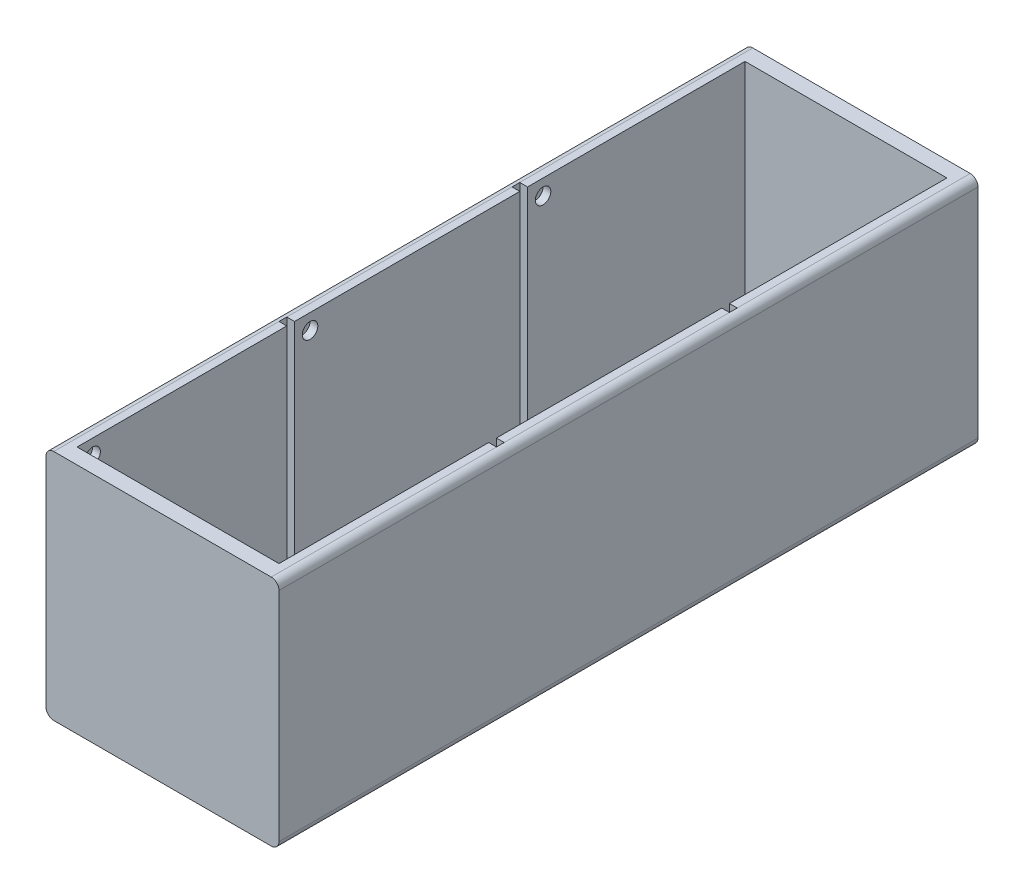
ISO-10303-21;
HEADER;
FILE_DESCRIPTION(('STEP AP214'),'2;1');
FILE_NAME('part.step','',(''),(''),'','','');
FILE_SCHEMA(('AUTOMOTIVE_DESIGN { 1 0 10303 214 1 1 1 1 }'));
ENDSEC;
DATA;
#1=APPLICATION_CONTEXT('core data for automotive mechanical design processes');
#2=APPLICATION_PROTOCOL_DEFINITION('international standard','automotive_design',2000,#1);
#3=PRODUCT_CONTEXT('',#1,'mechanical');
#4=PRODUCT('Part','Part','',(#3));
#5=PRODUCT_RELATED_PRODUCT_CATEGORY('part','',(#4));
#6=PRODUCT_DEFINITION_FORMATION('','',#4);
#7=PRODUCT_DEFINITION_CONTEXT('part definition',#1,'design');
#8=PRODUCT_DEFINITION('design','',#6,#7);
#9=PRODUCT_DEFINITION_SHAPE('','',#8);
#10=(LENGTH_UNIT() NAMED_UNIT(*) SI_UNIT(.MILLI.,.METRE.));
#11=(NAMED_UNIT(*) PLANE_ANGLE_UNIT() SI_UNIT($,.RADIAN.));
#12=(NAMED_UNIT(*) SI_UNIT($,.STERADIAN.) SOLID_ANGLE_UNIT());
#13=UNCERTAINTY_MEASURE_WITH_UNIT(LENGTH_MEASURE(1.E-05),#10,'distance_accuracy_value','');
#14=(GEOMETRIC_REPRESENTATION_CONTEXT(3) GLOBAL_UNCERTAINTY_ASSIGNED_CONTEXT((#13)) GLOBAL_UNIT_ASSIGNED_CONTEXT((#10,
#11,#12)) REPRESENTATION_CONTEXT('',''));
#15=CARTESIAN_POINT('',(0.,0.,0.));
#16=DIRECTION('',(0.,0.,1.));
#17=DIRECTION('',(1.,0.,0.));
#18=AXIS2_PLACEMENT_3D('',#15,#16,#17);
#19=CARTESIAN_POINT('',(-337.974683544304,94.3037974683544,900.));
#20=DIRECTION('',(0.,-1.,0.));
#21=DIRECTION('',(0.,0.,-1.));
#22=AXIS2_PLACEMENT_3D('',#19,#20,#21);
#23=PLANE('',#22);
#24=DIRECTION('',(-1.,0.,0.));
#25=VECTOR('',#24,1.);
#26=CARTESIAN_POINT('',(-337.974683544304,94.3037974683544,900.));
#27=LINE('',#26,#25);
#28=CARTESIAN_POINT('',(-47.9746835443037,94.3037974683544,900.));
#29=VERTEX_POINT('',#28);
#30=CARTESIAN_POINT('',(-327.974683544304,94.3037974683544,900.));
#31=VERTEX_POINT('',#30);
#32=EDGE_CURVE('E376',#29,#31,#27,.T.);
#33=ORIENTED_EDGE('',*,*,#32,.F.);
#34=DIRECTION('',(0.,0.,-1.));
#35=VECTOR('',#34,1.);
#36=CARTESIAN_POINT('',(-47.9746835443037,94.3037974683544,900.));
#37=LINE('',#36,#35);
#38=CARTESIAN_POINT('',(-47.9746835443038,94.3037974683544,610.));
#39=VERTEX_POINT('',#38);
#40=EDGE_CURVE('E406',#29,#39,#37,.T.);
#41=ORIENTED_EDGE('',*,*,#40,.T.);
#42=DIRECTION('',(1.,0.,0.));
#43=VECTOR('',#42,1.);
#44=CARTESIAN_POINT('',(-327.974683544304,94.3037974683544,610.));
#45=LINE('',#44,#43);
#46=CARTESIAN_POINT('',(-57.9746835443037,94.3037974683544,610.));
#47=VERTEX_POINT('',#46);
#48=EDGE_CURVE('E293',#47,#39,#45,.T.);
#49=ORIENTED_EDGE('',*,*,#48,.F.);
#50=DIRECTION('',(0.,0.,-1.));
#51=VECTOR('',#50,1.);
#52=CARTESIAN_POINT('',(-57.9746835443037,94.3037974683544,900.));
#53=LINE('',#52,#51);
#54=CARTESIAN_POINT('',(-57.9746835443038,94.3037974683544,880.));
#55=VERTEX_POINT('',#54);
#56=EDGE_CURVE('E362',#55,#47,#53,.T.);
#57=ORIENTED_EDGE('',*,*,#56,.F.);
#58=DIRECTION('',(-1.,0.,0.));
#59=VECTOR('',#58,1.);
#60=CARTESIAN_POINT('',(-337.974683544304,94.3037974683544,880.));
#61=LINE('',#60,#59);
#62=CARTESIAN_POINT('',(-317.974683544304,94.3037974683544,880.));
#63=VERTEX_POINT('',#62);
#64=EDGE_CURVE('E353',#55,#63,#61,.T.);
#65=ORIENTED_EDGE('',*,*,#64,.T.);
#66=DIRECTION('',(0.,0.,-1.));
#67=VECTOR('',#66,1.);
#68=CARTESIAN_POINT('',(-317.974683544304,94.3037974683544,900.));
#69=LINE('',#68,#67);
#70=CARTESIAN_POINT('',(-317.974683544304,94.3037974683544,610.));
#71=VERTEX_POINT('',#70);
#72=EDGE_CURVE('E354',#63,#71,#69,.T.);
#73=ORIENTED_EDGE('',*,*,#72,.T.);
#74=CARTESIAN_POINT('',(-327.974683544304,94.3037974683544,610.));
#75=VERTEX_POINT('',#74);
#76=EDGE_CURVE('E294',#75,#71,#45,.T.);
#77=ORIENTED_EDGE('',*,*,#76,.F.);
#78=DIRECTION('',(0.,0.,-1.));
#79=VECTOR('',#78,1.);
#80=CARTESIAN_POINT('',(-327.974683544304,94.3037974683544,900.));
#81=LINE('',#80,#79);
#82=EDGE_CURVE('E396',#75,#31,#81,.F.);
#83=ORIENTED_EDGE('',*,*,#82,.T.);
#84=EDGE_LOOP('',(#33,#41,#49,#57,#65,#73,#77,#83));
#85=FACE_BOUND('',#84,.T.);
#86=ADVANCED_FACE('F39',(#85),#23,.F.);
#87=DIRECTION('',(-1.,0.,0.));
#88=VECTOR('',#87,1.);
#89=CARTESIAN_POINT('',(-327.974683544304,94.3037974683544,600.));
#90=LINE('',#89,#88);
#91=CARTESIAN_POINT('',(-47.9746835443038,94.3037974683544,600.));
#92=VERTEX_POINT('',#91);
#93=CARTESIAN_POINT('',(-57.9746835443037,94.3037974683544,600.));
#94=VERTEX_POINT('',#93);
#95=EDGE_CURVE('E287',#92,#94,#90,.T.);
#96=ORIENTED_EDGE('',*,*,#95,.F.);
#97=DIRECTION('',(0.,0.,-1.));
#98=VECTOR('',#97,1.);
#99=CARTESIAN_POINT('',(-47.9746835443037,94.3037974683544,900.));
#100=LINE('',#99,#98);
#101=CARTESIAN_POINT('',(-47.9746835443038,94.3037974683544,310.));
#102=VERTEX_POINT('',#101);
#103=EDGE_CURVE('E404',#92,#102,#100,.T.);
#104=ORIENTED_EDGE('',*,*,#103,.T.);
#105=DIRECTION('',(1.,0.,0.));
#106=VECTOR('',#105,1.);
#107=CARTESIAN_POINT('',(-327.974683544304,94.3037974683544,310.));
#108=LINE('',#107,#106);
#109=CARTESIAN_POINT('',(-57.9746835443037,94.3037974683544,310.));
#110=VERTEX_POINT('',#109);
#111=EDGE_CURVE('E262',#110,#102,#108,.T.);
#112=ORIENTED_EDGE('',*,*,#111,.F.);
#113=EDGE_CURVE('E365',#94,#110,#53,.T.);
#114=ORIENTED_EDGE('',*,*,#113,.F.);
#115=EDGE_LOOP('',(#96,#104,#112,#114));
#116=FACE_BOUND('',#115,.T.);
#117=ADVANCED_FACE('F479',(#116),#23,.F.);
#118=DIRECTION('',(-1.,0.,0.));
#119=VECTOR('',#118,1.);
#120=CARTESIAN_POINT('',(-327.974683544304,94.3037974683544,300.));
#121=LINE('',#120,#119);
#122=CARTESIAN_POINT('',(-47.9746835443037,94.3037974683544,300.));
#123=VERTEX_POINT('',#122);
#124=CARTESIAN_POINT('',(-57.9746835443037,94.3037974683544,300.));
#125=VERTEX_POINT('',#124);
#126=EDGE_CURVE('E251',#123,#125,#121,.T.);
#127=ORIENTED_EDGE('',*,*,#126,.F.);
#128=DIRECTION('',(0.,0.,-1.));
#129=VECTOR('',#128,1.);
#130=CARTESIAN_POINT('',(-47.9746835443037,94.3037974683544,900.));
#131=LINE('',#130,#129);
#132=CARTESIAN_POINT('',(-47.9746835443037,94.3037974683544,0.));
#133=VERTEX_POINT('',#132);
#134=EDGE_CURVE('E402',#123,#133,#131,.T.);
#135=ORIENTED_EDGE('',*,*,#134,.T.);
#136=DIRECTION('',(-1.,0.,0.));
#137=VECTOR('',#136,1.);
#138=CARTESIAN_POINT('',(-337.974683544304,94.3037974683544,0.));
#139=LINE('',#138,#137);
#140=CARTESIAN_POINT('',(-327.974683544304,94.3037974683544,0.));
#141=VERTEX_POINT('',#140);
#142=EDGE_CURVE('E371',#133,#141,#139,.T.);
#143=ORIENTED_EDGE('',*,*,#142,.T.);
#144=DIRECTION('',(0.,0.,-1.));
#145=VECTOR('',#144,1.);
#146=CARTESIAN_POINT('',(-327.974683544304,94.3037974683544,900.));
#147=LINE('',#146,#145);
#148=CARTESIAN_POINT('',(-327.974683544304,94.3037974683544,300.));
#149=VERTEX_POINT('',#148);
#150=EDGE_CURVE('E400',#141,#149,#147,.F.);
#151=ORIENTED_EDGE('',*,*,#150,.T.);
#152=CARTESIAN_POINT('',(-317.974683544304,94.3037974683544,300.));
#153=VERTEX_POINT('',#152);
#154=EDGE_CURVE('E253',#153,#149,#121,.T.);
#155=ORIENTED_EDGE('',*,*,#154,.F.);
#156=CARTESIAN_POINT('',(-317.974683544304,94.3037974683544,20.));
#157=VERTEX_POINT('',#156);
#158=EDGE_CURVE('E359',#153,#157,#69,.T.);
#159=ORIENTED_EDGE('',*,*,#158,.T.);
#160=DIRECTION('',(-1.,0.,0.));
#161=VECTOR('',#160,1.);
#162=CARTESIAN_POINT('',(-337.974683544304,94.3037974683544,20.));
#163=LINE('',#162,#161);
#164=CARTESIAN_POINT('',(-57.9746835443038,94.3037974683544,20.));
#165=VERTEX_POINT('',#164);
#166=EDGE_CURVE('E338',#165,#157,#163,.T.);
#167=ORIENTED_EDGE('',*,*,#166,.F.);
#168=EDGE_CURVE('E357',#125,#165,#53,.T.);
#169=ORIENTED_EDGE('',*,*,#168,.F.);
#170=EDGE_LOOP('',(#127,#135,#143,#151,#155,#159,#167,#169));
#171=FACE_BOUND('',#170,.T.);
#172=ADVANCED_FACE('F511',(#171),#23,.F.);
#173=CARTESIAN_POINT('',(-317.974683544304,94.3037974683544,900.));
#174=DIRECTION('',(1.,0.,0.));
#175=DIRECTION('',(0.,1.,0.));
#176=AXIS2_PLACEMENT_3D('',#173,#174,#175);
#177=PLANE('',#176);
#178=CARTESIAN_POINT('',(-317.974683544304,74.3037974683544,280.));
#179=DIRECTION('',(1.,0.,0.));
#180=DIRECTION('',(0.,1.,0.));
#181=AXIS2_PLACEMENT_3D('',#178,#179,#180);
#182=CIRCLE('',#181,9.99999999999998);
#183=CARTESIAN_POINT('',(-317.974683544304,84.3037974683544,280.));
#184=VERTEX_POINT('',#183);
#185=EDGE_CURVE('E609',#184,#184,#182,.T.);
#186=ORIENTED_EDGE('',*,*,#185,.F.);
#187=EDGE_LOOP('',(#186));
#188=FACE_BOUND('',#187,.T.);
#189=DIRECTION('',(0.,1.,0.));
#190=VECTOR('',#189,1.);
#191=CARTESIAN_POINT('',(-317.974683544304,94.3037974683544,300.));
#192=LINE('',#191,#190);
#193=CARTESIAN_POINT('',(-317.974683544304,-185.696202531646,300.));
#194=VERTEX_POINT('',#193);
#195=EDGE_CURVE('E322',#194,#153,#192,.T.);
#196=ORIENTED_EDGE('',*,*,#195,.F.);
#197=DIRECTION('',(0.,0.,-1.));
#198=VECTOR('',#197,1.);
#199=CARTESIAN_POINT('',(-317.974683544304,-185.696202531646,900.));
#200=LINE('',#199,#198);
#201=CARTESIAN_POINT('',(-317.974683544304,-185.696202531646,20.));
#202=VERTEX_POINT('',#201);
#203=EDGE_CURVE('E333',#194,#202,#200,.T.);
#204=ORIENTED_EDGE('',*,*,#203,.T.);
#205=DIRECTION('',(0.,-1.,0.));
#206=VECTOR('',#205,1.);
#207=CARTESIAN_POINT('',(-317.974683544304,94.3037974683544,20.));
#208=LINE('',#207,#206);
#209=EDGE_CURVE('E324',#157,#202,#208,.T.);
#210=ORIENTED_EDGE('',*,*,#209,.F.);
#211=ORIENTED_EDGE('',*,*,#158,.F.);
#212=EDGE_LOOP('',(#196,#204,#210,#211));
#213=FACE_BOUND('',#212,.T.);
#214=ADVANCED_FACE('F516',(#188,#213),#177,.T.);
#215=CARTESIAN_POINT('',(-317.974683544304,74.3037974683544,580.));
#216=DIRECTION('',(1.,0.,0.));
#217=DIRECTION('',(0.,1.,0.));
#218=AXIS2_PLACEMENT_3D('',#215,#216,#217);
#219=CIRCLE('',#218,9.99999999999998);
#220=CARTESIAN_POINT('',(-317.974683544304,84.3037974683544,580.));
#221=VERTEX_POINT('',#220);
#222=EDGE_CURVE('E256',#221,#221,#219,.T.);
#223=ORIENTED_EDGE('',*,*,#222,.F.);
#224=EDGE_LOOP('',(#223));
#225=FACE_BOUND('',#224,.T.);
#226=DIRECTION('',(0.,-1.,0.));
#227=VECTOR('',#226,1.);
#228=CARTESIAN_POINT('',(-317.974683544304,94.3037974683544,310.));
#229=LINE('',#228,#227);
#230=CARTESIAN_POINT('',(-317.974683544304,94.3037974683544,310.));
#231=VERTEX_POINT('',#230);
#232=CARTESIAN_POINT('',(-317.974683544304,-185.696202531646,310.));
#233=VERTEX_POINT('',#232);
#234=EDGE_CURVE('E318',#231,#233,#229,.T.);
#235=ORIENTED_EDGE('',*,*,#234,.F.);
#236=CARTESIAN_POINT('',(-317.974683544304,94.3037974683544,600.));
#237=VERTEX_POINT('',#236);
#238=EDGE_CURVE('E358',#237,#231,#69,.T.);
#239=ORIENTED_EDGE('',*,*,#238,.F.);
#240=DIRECTION('',(0.,1.,0.));
#241=VECTOR('',#240,1.);
#242=CARTESIAN_POINT('',(-317.974683544304,94.3037974683544,600.));
#243=LINE('',#242,#241);
#244=CARTESIAN_POINT('',(-317.974683544304,-185.696202531646,600.));
#245=VERTEX_POINT('',#244);
#246=EDGE_CURVE('E314',#245,#237,#243,.T.);
#247=ORIENTED_EDGE('',*,*,#246,.F.);
#248=EDGE_CURVE('E332',#245,#233,#200,.T.);
#249=ORIENTED_EDGE('',*,*,#248,.T.);
#250=EDGE_LOOP('',(#235,#239,#247,#249));
#251=FACE_BOUND('',#250,.T.);
#252=ADVANCED_FACE('F522',(#225,#251),#177,.T.);
#253=CARTESIAN_POINT('',(-337.974683544304,-185.696202531646,900.));
#254=DIRECTION('',(0.,1.,0.));
#255=DIRECTION('',(0.,0.,1.));
#256=AXIS2_PLACEMENT_3D('',#253,#254,#255);
#257=PLANE('',#256);
#258=DIRECTION('',(-1.,0.,0.));
#259=VECTOR('',#258,1.);
#260=CARTESIAN_POINT('',(-337.974683544304,-185.696202531646,300.));
#261=LINE('',#260,#259);
#262=CARTESIAN_POINT('',(-57.9746835443037,-185.696202531646,300.));
#263=VERTEX_POINT('',#262);
#264=EDGE_CURVE('E320',#263,#194,#261,.T.);
#265=ORIENTED_EDGE('',*,*,#264,.F.);
#266=DIRECTION('',(0.,0.,-1.));
#267=VECTOR('',#266,1.);
#268=CARTESIAN_POINT('',(-57.9746835443037,-185.696202531646,900.));
#269=LINE('',#268,#267);
#270=CARTESIAN_POINT('',(-57.9746835443037,-185.696202531646,20.));
#271=VERTEX_POINT('',#270);
#272=EDGE_CURVE('E346',#263,#271,#269,.T.);
#273=ORIENTED_EDGE('',*,*,#272,.T.);
#274=DIRECTION('',(1.,0.,0.));
#275=VECTOR('',#274,1.);
#276=CARTESIAN_POINT('',(-337.974683544304,-185.696202531646,20.));
#277=LINE('',#276,#275);
#278=EDGE_CURVE('E327',#202,#271,#277,.T.);
#279=ORIENTED_EDGE('',*,*,#278,.F.);
#280=ORIENTED_EDGE('',*,*,#203,.F.);
#281=EDGE_LOOP('',(#265,#273,#279,#280));
#282=FACE_BOUND('',#281,.T.);
#283=ADVANCED_FACE('F498',(#282),#257,.T.);
#284=DIRECTION('',(1.,0.,0.));
#285=VECTOR('',#284,1.);
#286=CARTESIAN_POINT('',(-337.974683544304,-185.696202531646,310.));
#287=LINE('',#286,#285);
#288=CARTESIAN_POINT('',(-57.9746835443037,-185.696202531646,310.));
#289=VERTEX_POINT('',#288);
#290=EDGE_CURVE('E316',#233,#289,#287,.T.);
#291=ORIENTED_EDGE('',*,*,#290,.F.);
#292=ORIENTED_EDGE('',*,*,#248,.F.);
#293=DIRECTION('',(-1.,0.,0.));
#294=VECTOR('',#293,1.);
#295=CARTESIAN_POINT('',(-337.974683544304,-185.696202531646,600.));
#296=LINE('',#295,#294);
#297=CARTESIAN_POINT('',(-57.9746835443037,-185.696202531646,600.));
#298=VERTEX_POINT('',#297);
#299=EDGE_CURVE('E312',#298,#245,#296,.T.);
#300=ORIENTED_EDGE('',*,*,#299,.F.);
#301=EDGE_CURVE('E345',#298,#289,#269,.T.);
#302=ORIENTED_EDGE('',*,*,#301,.T.);
#303=EDGE_LOOP('',(#291,#292,#300,#302));
#304=FACE_BOUND('',#303,.T.);
#305=ADVANCED_FACE('F525',(#304),#257,.T.);
#306=CARTESIAN_POINT('',(-57.9746835443038,94.3037974683544,900.));
#307=DIRECTION('',(-1.,0.,0.));
#308=DIRECTION('',(0.,-1.,0.));
#309=AXIS2_PLACEMENT_3D('',#306,#307,#308);
#310=PLANE('',#309);
#311=DIRECTION('',(0.,-1.,0.));
#312=VECTOR('',#311,1.);
#313=CARTESIAN_POINT('',(-57.9746835443038,94.3037974683544,300.));
#314=LINE('',#313,#312);
#315=EDGE_CURVE('E394',#125,#263,#314,.T.);
#316=ORIENTED_EDGE('',*,*,#315,.F.);
#317=ORIENTED_EDGE('',*,*,#168,.T.);
#318=DIRECTION('',(0.,1.,0.));
#319=VECTOR('',#318,1.);
#320=CARTESIAN_POINT('',(-57.9746835443038,94.3037974683544,20.));
#321=LINE('',#320,#319);
#322=EDGE_CURVE('E341',#271,#165,#321,.T.);
#323=ORIENTED_EDGE('',*,*,#322,.F.);
#324=ORIENTED_EDGE('',*,*,#272,.F.);
#325=EDGE_LOOP('',(#316,#317,#323,#324));
#326=FACE_BOUND('',#325,.T.);
#327=ADVANCED_FACE('F507',(#326),#310,.T.);
#328=DIRECTION('',(0.,1.,0.));
#329=VECTOR('',#328,1.);
#330=CARTESIAN_POINT('',(-57.9746835443038,94.3037974683544,310.));
#331=LINE('',#330,#329);
#332=EDGE_CURVE('E392',#289,#110,#331,.T.);
#333=ORIENTED_EDGE('',*,*,#332,.F.);
#334=ORIENTED_EDGE('',*,*,#301,.F.);
#335=DIRECTION('',(0.,-1.,0.));
#336=VECTOR('',#335,1.);
#337=CARTESIAN_POINT('',(-57.9746835443038,94.3037974683544,600.));
#338=LINE('',#337,#336);
#339=EDGE_CURVE('E390',#94,#298,#338,.T.);
#340=ORIENTED_EDGE('',*,*,#339,.F.);
#341=ORIENTED_EDGE('',*,*,#113,.T.);
#342=EDGE_LOOP('',(#333,#334,#340,#341));
#343=FACE_BOUND('',#342,.T.);
#344=ADVANCED_FACE('F490',(#343),#310,.T.);
#345=CARTESIAN_POINT('',(-327.974683544304,94.3037974683544,310.));
#346=VERTEX_POINT('',#345);
#347=EDGE_CURVE('E264',#346,#231,#108,.T.);
#348=ORIENTED_EDGE('',*,*,#347,.F.);
#349=DIRECTION('',(0.,0.,-1.));
#350=VECTOR('',#349,1.);
#351=CARTESIAN_POINT('',(-327.974683544304,94.3037974683544,900.));
#352=LINE('',#351,#350);
#353=CARTESIAN_POINT('',(-327.974683544304,94.3037974683544,600.));
#354=VERTEX_POINT('',#353);
#355=EDGE_CURVE('E398',#346,#354,#352,.F.);
#356=ORIENTED_EDGE('',*,*,#355,.T.);
#357=EDGE_CURVE('E290',#237,#354,#90,.T.);
#358=ORIENTED_EDGE('',*,*,#357,.F.);
#359=ORIENTED_EDGE('',*,*,#238,.T.);
#360=EDGE_LOOP('',(#348,#356,#358,#359));
#361=FACE_BOUND('',#360,.T.);
#362=ADVANCED_FACE('F528',(#361),#23,.F.);
#363=CARTESIAN_POINT('',(-337.974683544304,94.3037974683544,900.));
#364=DIRECTION('',(1.,0.,0.));
#365=DIRECTION('',(0.,1.,0.));
#366=AXIS2_PLACEMENT_3D('',#363,#364,#365);
#367=PLANE('',#366);
#368=DIRECTION('',(0.,-1.,0.));
#369=VECTOR('',#368,1.);
#370=CARTESIAN_POINT('',(-337.974683544304,94.3037974683544,0.));
#371=LINE('',#370,#369);
#372=CARTESIAN_POINT('',(-337.974683544304,84.3037974683544,0.));
#373=VERTEX_POINT('',#372);
#374=CARTESIAN_POINT('',(-337.974683544304,-195.696202531646,0.));
#375=VERTEX_POINT('',#374);
#376=EDGE_CURVE('E331',#373,#375,#371,.T.);
#377=ORIENTED_EDGE('',*,*,#376,.T.);
#378=DIRECTION('',(0.,0.,-1.));
#379=VECTOR('',#378,1.);
#380=CARTESIAN_POINT('',(-337.974683544304,-195.696202531646,900.));
#381=LINE('',#380,#379);
#382=CARTESIAN_POINT('',(-337.974683544304,-195.696202531646,900.));
#383=VERTEX_POINT('',#382);
#384=EDGE_CURVE('E11',#375,#383,#381,.F.);
#385=ORIENTED_EDGE('',*,*,#384,.T.);
#386=DIRECTION('',(0.,-1.,0.));
#387=VECTOR('',#386,1.);
#388=CARTESIAN_POINT('',(-337.974683544304,94.3037974683544,900.));
#389=LINE('',#388,#387);
#390=CARTESIAN_POINT('',(-337.974683544304,84.3037974683544,900.));
#391=VERTEX_POINT('',#390);
#392=EDGE_CURVE('E368',#391,#383,#389,.T.);
#393=ORIENTED_EDGE('',*,*,#392,.F.);
#394=DIRECTION('',(0.,0.,-1.));
#395=VECTOR('',#394,1.);
#396=CARTESIAN_POINT('',(-337.974683544304,84.3037974683544,900.));
#397=LINE('',#396,#395);
#398=EDGE_CURVE('E47',#391,#373,#397,.T.);
#399=ORIENTED_EDGE('',*,*,#398,.T.);
#400=EDGE_LOOP('',(#377,#385,#393,#399));
#401=FACE_BOUND('',#400,.T.);
#402=ADVANCED_FACE('F437',(#401),#367,.F.);
#403=CARTESIAN_POINT('',(-337.974683544304,-205.696202531646,900.));
#404=DIRECTION('',(0.,1.,0.));
#405=DIRECTION('',(0.,0.,1.));
#406=AXIS2_PLACEMENT_3D('',#403,#404,#405);
#407=PLANE('',#406);
#408=DIRECTION('',(1.,0.,0.));
#409=VECTOR('',#408,1.);
#410=CARTESIAN_POINT('',(-337.974683544304,-205.696202531646,0.));
#411=LINE('',#410,#409);
#412=CARTESIAN_POINT('',(-327.974683544304,-205.696202531646,0.));
#413=VERTEX_POINT('',#412);
#414=CARTESIAN_POINT('',(-47.9746835443037,-205.696202531646,0.));
#415=VERTEX_POINT('',#414);
#416=EDGE_CURVE('E382',#413,#415,#411,.T.);
#417=ORIENTED_EDGE('',*,*,#416,.T.);
#418=DIRECTION('',(0.,0.,-1.));
#419=VECTOR('',#418,1.);
#420=CARTESIAN_POINT('',(-47.9746835443037,-205.696202531646,900.));
#421=LINE('',#420,#419);
#422=CARTESIAN_POINT('',(-47.9746835443037,-205.696202531646,900.));
#423=VERTEX_POINT('',#422);
#424=EDGE_CURVE('E54',#415,#423,#421,.F.);
#425=ORIENTED_EDGE('',*,*,#424,.T.);
#426=DIRECTION('',(1.,0.,0.));
#427=VECTOR('',#426,1.);
#428=CARTESIAN_POINT('',(-337.974683544304,-205.696202531646,900.));
#429=LINE('',#428,#427);
#430=CARTESIAN_POINT('',(-327.974683544304,-205.696202531646,900.));
#431=VERTEX_POINT('',#430);
#432=EDGE_CURVE('E370',#431,#423,#429,.T.);
#433=ORIENTED_EDGE('',*,*,#432,.F.);
#434=DIRECTION('',(0.,0.,-1.));
#435=VECTOR('',#434,1.);
#436=CARTESIAN_POINT('',(-327.974683544304,-205.696202531646,900.));
#437=LINE('',#436,#435);
#438=EDGE_CURVE('E429',#431,#413,#437,.T.);
#439=ORIENTED_EDGE('',*,*,#438,.T.);
#440=EDGE_LOOP('',(#417,#425,#433,#439));
#441=FACE_BOUND('',#440,.T.);
#442=ADVANCED_FACE('F448',(#441),#407,.F.);
#443=CARTESIAN_POINT('',(-37.9746835443038,94.3037974683544,900.));
#444=DIRECTION('',(-1.,0.,0.));
#445=DIRECTION('',(0.,-1.,0.));
#446=AXIS2_PLACEMENT_3D('',#443,#444,#445);
#447=PLANE('',#446);
#448=DIRECTION('',(0.,1.,0.));
#449=VECTOR('',#448,1.);
#450=CARTESIAN_POINT('',(-37.9746835443038,94.3037974683544,0.));
#451=LINE('',#450,#449);
#452=CARTESIAN_POINT('',(-37.9746835443037,-195.696202531646,0.));
#453=VERTEX_POINT('',#452);
#454=CARTESIAN_POINT('',(-37.9746835443038,84.3037974683544,0.));
#455=VERTEX_POINT('',#454);
#456=EDGE_CURVE('E384',#453,#455,#451,.T.);
#457=ORIENTED_EDGE('',*,*,#456,.T.);
#458=DIRECTION('',(0.,0.,-1.));
#459=VECTOR('',#458,1.);
#460=CARTESIAN_POINT('',(-37.9746835443038,84.3037974683544,900.));
#461=LINE('',#460,#459);
#462=CARTESIAN_POINT('',(-37.9746835443038,84.3037974683544,900.));
#463=VERTEX_POINT('',#462);
#464=EDGE_CURVE('E420',#455,#463,#461,.F.);
#465=ORIENTED_EDGE('',*,*,#464,.T.);
#466=DIRECTION('',(0.,1.,0.));
#467=VECTOR('',#466,1.);
#468=CARTESIAN_POINT('',(-37.9746835443038,94.3037974683544,900.));
#469=LINE('',#468,#467);
#470=CARTESIAN_POINT('',(-37.9746835443037,-195.696202531646,900.));
#471=VERTEX_POINT('',#470);
#472=EDGE_CURVE('E373',#471,#463,#469,.T.);
#473=ORIENTED_EDGE('',*,*,#472,.F.);
#474=DIRECTION('',(0.,0.,-1.));
#475=VECTOR('',#474,1.);
#476=CARTESIAN_POINT('',(-37.9746835443037,-195.696202531646,900.));
#477=LINE('',#476,#475);
#478=EDGE_CURVE('E417',#471,#453,#477,.T.);
#479=ORIENTED_EDGE('',*,*,#478,.T.);
#480=EDGE_LOOP('',(#457,#465,#473,#479));
#481=FACE_BOUND('',#480,.T.);
#482=ADVANCED_FACE('F457',(#481),#447,.F.);
#483=CARTESIAN_POINT('',(0.,0.,900.));
#484=DIRECTION('',(0.,0.,1.));
#485=DIRECTION('',(1.,0.,0.));
#486=AXIS2_PLACEMENT_3D('',#483,#484,#485);
#487=PLANE('',#486);
#488=ORIENTED_EDGE('',*,*,#472,.T.);
#489=CARTESIAN_POINT('',(-47.9746835443037,84.3037974683544,900.));
#490=DIRECTION('',(0.,0.,1.));
#491=DIRECTION('',(1.,0.,0.));
#492=AXIS2_PLACEMENT_3D('',#489,#490,#491);
#493=CIRCLE('',#492,10.);
#494=EDGE_CURVE('E427',#463,#29,#493,.T.);
#495=ORIENTED_EDGE('',*,*,#494,.T.);
#496=ORIENTED_EDGE('',*,*,#32,.T.);
#497=CARTESIAN_POINT('',(-327.974683544304,84.3037974683544,900.));
#498=DIRECTION('',(0.,0.,1.));
#499=DIRECTION('',(1.,0.,0.));
#500=AXIS2_PLACEMENT_3D('',#497,#498,#499);
#501=CIRCLE('',#500,10.);
#502=EDGE_CURVE('E422',#31,#391,#501,.T.);
#503=ORIENTED_EDGE('',*,*,#502,.T.);
#504=ORIENTED_EDGE('',*,*,#392,.T.);
#505=CARTESIAN_POINT('',(-327.974683544304,-195.696202531646,900.));
#506=DIRECTION('',(0.,0.,1.));
#507=DIRECTION('',(1.,0.,0.));
#508=AXIS2_PLACEMENT_3D('',#505,#506,#507);
#509=CIRCLE('',#508,10.);
#510=EDGE_CURVE('E61',#383,#431,#509,.T.);
#511=ORIENTED_EDGE('',*,*,#510,.T.);
#512=ORIENTED_EDGE('',*,*,#432,.T.);
#513=CARTESIAN_POINT('',(-47.9746835443037,-195.696202531646,900.));
#514=DIRECTION('',(0.,0.,1.));
#515=DIRECTION('',(1.,0.,0.));
#516=AXIS2_PLACEMENT_3D('',#513,#514,#515);
#517=CIRCLE('',#516,10.);
#518=EDGE_CURVE('E425',#423,#471,#517,.T.);
#519=ORIENTED_EDGE('',*,*,#518,.T.);
#520=EDGE_LOOP('',(#488,#495,#496,#503,#504,#511,#512,#519));
#521=FACE_BOUND('',#520,.T.);
#522=ADVANCED_FACE('F450',(#521),#487,.T.);
#523=CARTESIAN_POINT('',(0.,0.,0.));
#524=DIRECTION('',(0.,0.,1.));
#525=DIRECTION('',(1.,0.,0.));
#526=AXIS2_PLACEMENT_3D('',#523,#524,#525);
#527=PLANE('',#526);
#528=ORIENTED_EDGE('',*,*,#142,.F.);
#529=CARTESIAN_POINT('',(-47.9746835443037,84.3037974683544,0.));
#530=DIRECTION('',(0.,0.,1.));
#531=DIRECTION('',(1.,0.,0.));
#532=AXIS2_PLACEMENT_3D('',#529,#530,#531);
#533=CIRCLE('',#532,10.);
#534=EDGE_CURVE('E415',#133,#455,#533,.F.);
#535=ORIENTED_EDGE('',*,*,#534,.T.);
#536=ORIENTED_EDGE('',*,*,#456,.F.);
#537=CARTESIAN_POINT('',(-47.9746835443037,-195.696202531646,0.));
#538=DIRECTION('',(0.,0.,1.));
#539=DIRECTION('',(1.,0.,0.));
#540=AXIS2_PLACEMENT_3D('',#537,#538,#539);
#541=CIRCLE('',#540,10.);
#542=EDGE_CURVE('E413',#453,#415,#541,.F.);
#543=ORIENTED_EDGE('',*,*,#542,.T.);
#544=ORIENTED_EDGE('',*,*,#416,.F.);
#545=CARTESIAN_POINT('',(-327.974683544304,-195.696202531646,0.));
#546=DIRECTION('',(0.,0.,1.));
#547=DIRECTION('',(1.,0.,0.));
#548=AXIS2_PLACEMENT_3D('',#545,#546,#547);
#549=CIRCLE('',#548,10.);
#550=EDGE_CURVE('E411',#413,#375,#549,.F.);
#551=ORIENTED_EDGE('',*,*,#550,.T.);
#552=ORIENTED_EDGE('',*,*,#376,.F.);
#553=CARTESIAN_POINT('',(-327.974683544304,84.3037974683544,0.));
#554=DIRECTION('',(0.,0.,1.));
#555=DIRECTION('',(1.,0.,0.));
#556=AXIS2_PLACEMENT_3D('',#553,#554,#555);
#557=CIRCLE('',#556,10.);
#558=EDGE_CURVE('E409',#373,#141,#557,.F.);
#559=ORIENTED_EDGE('',*,*,#558,.T.);
#560=EDGE_LOOP('',(#528,#535,#536,#543,#544,#551,#552,#559));
#561=FACE_BOUND('',#560,.T.);
#562=ADVANCED_FACE('F443',(#561),#527,.F.);
#563=CARTESIAN_POINT('',(-317.974683544304,74.3037974683544,860.));
#564=DIRECTION('',(1.,0.,0.));
#565=DIRECTION('',(0.,1.,0.));
#566=AXIS2_PLACEMENT_3D('',#563,#564,#565);
#567=CIRCLE('',#566,9.99999999999988);
#568=CARTESIAN_POINT('',(-317.974683544304,84.3037974683543,860.));
#569=VERTEX_POINT('',#568);
#570=EDGE_CURVE('E603',#569,#569,#567,.T.);
#571=ORIENTED_EDGE('',*,*,#570,.F.);
#572=EDGE_LOOP('',(#571));
#573=FACE_BOUND('',#572,.T.);
#574=DIRECTION('',(0.,-1.,0.));
#575=VECTOR('',#574,1.);
#576=CARTESIAN_POINT('',(-317.974683544304,94.3037974683544,610.));
#577=LINE('',#576,#575);
#578=CARTESIAN_POINT('',(-317.974683544304,-185.696202531646,610.));
#579=VERTEX_POINT('',#578);
#580=EDGE_CURVE('E310',#71,#579,#577,.T.);
#581=ORIENTED_EDGE('',*,*,#580,.F.);
#582=ORIENTED_EDGE('',*,*,#72,.F.);
#583=DIRECTION('',(0.,-1.,0.));
#584=VECTOR('',#583,1.);
#585=CARTESIAN_POINT('',(-317.974683544304,94.3037974683544,880.));
#586=LINE('',#585,#584);
#587=CARTESIAN_POINT('',(-317.974683544304,-185.696202531646,880.));
#588=VERTEX_POINT('',#587);
#589=EDGE_CURVE('E334',#63,#588,#586,.T.);
#590=ORIENTED_EDGE('',*,*,#589,.T.);
#591=EDGE_CURVE('E328',#588,#579,#200,.T.);
#592=ORIENTED_EDGE('',*,*,#591,.T.);
#593=EDGE_LOOP('',(#581,#582,#590,#592));
#594=FACE_BOUND('',#593,.T.);
#595=ADVANCED_FACE('F542',(#573,#594),#177,.T.);
#596=DIRECTION('',(1.,0.,0.));
#597=VECTOR('',#596,1.);
#598=CARTESIAN_POINT('',(-337.974683544304,-185.696202531646,610.));
#599=LINE('',#598,#597);
#600=CARTESIAN_POINT('',(-57.9746835443037,-185.696202531646,610.));
#601=VERTEX_POINT('',#600);
#602=EDGE_CURVE('E271',#579,#601,#599,.T.);
#603=ORIENTED_EDGE('',*,*,#602,.F.);
#604=ORIENTED_EDGE('',*,*,#591,.F.);
#605=DIRECTION('',(1.,0.,0.));
#606=VECTOR('',#605,1.);
#607=CARTESIAN_POINT('',(-337.974683544304,-185.696202531646,880.));
#608=LINE('',#607,#606);
#609=CARTESIAN_POINT('',(-57.9746835443037,-185.696202531646,880.));
#610=VERTEX_POINT('',#609);
#611=EDGE_CURVE('E337',#588,#610,#608,.T.);
#612=ORIENTED_EDGE('',*,*,#611,.T.);
#613=EDGE_CURVE('E342',#610,#601,#269,.T.);
#614=ORIENTED_EDGE('',*,*,#613,.T.);
#615=EDGE_LOOP('',(#603,#604,#612,#614));
#616=FACE_BOUND('',#615,.T.);
#617=ADVANCED_FACE('F546',(#616),#257,.T.);
#618=DIRECTION('',(0.,1.,0.));
#619=VECTOR('',#618,1.);
#620=CARTESIAN_POINT('',(-57.9746835443038,94.3037974683544,610.));
#621=LINE('',#620,#619);
#622=EDGE_CURVE('E379',#601,#47,#621,.T.);
#623=ORIENTED_EDGE('',*,*,#622,.F.);
#624=ORIENTED_EDGE('',*,*,#613,.F.);
#625=DIRECTION('',(0.,1.,0.));
#626=VECTOR('',#625,1.);
#627=CARTESIAN_POINT('',(-57.9746835443038,94.3037974683544,880.));
#628=LINE('',#627,#626);
#629=EDGE_CURVE('E348',#610,#55,#628,.T.);
#630=ORIENTED_EDGE('',*,*,#629,.T.);
#631=ORIENTED_EDGE('',*,*,#56,.T.);
#632=EDGE_LOOP('',(#623,#624,#630,#631));
#633=FACE_BOUND('',#632,.T.);
#634=ADVANCED_FACE('F550',(#633),#310,.T.);
#635=CARTESIAN_POINT('',(0.,0.,880.));
#636=DIRECTION('',(0.,0.,1.));
#637=DIRECTION('',(1.,0.,0.));
#638=AXIS2_PLACEMENT_3D('',#635,#636,#637);
#639=PLANE('',#638);
#640=ORIENTED_EDGE('',*,*,#589,.F.);
#641=ORIENTED_EDGE('',*,*,#64,.F.);
#642=ORIENTED_EDGE('',*,*,#629,.F.);
#643=ORIENTED_EDGE('',*,*,#611,.F.);
#644=EDGE_LOOP('',(#640,#641,#642,#643));
#645=FACE_BOUND('',#644,.T.);
#646=ADVANCED_FACE('F831',(#645),#639,.F.);
#647=CARTESIAN_POINT('',(0.,0.,20.));
#648=DIRECTION('',(0.,0.,1.));
#649=DIRECTION('',(1.,0.,0.));
#650=AXIS2_PLACEMENT_3D('',#647,#648,#649);
#651=PLANE('',#650);
#652=ORIENTED_EDGE('',*,*,#209,.T.);
#653=ORIENTED_EDGE('',*,*,#278,.T.);
#654=ORIENTED_EDGE('',*,*,#322,.T.);
#655=ORIENTED_EDGE('',*,*,#166,.T.);
#656=EDGE_LOOP('',(#652,#653,#654,#655));
#657=FACE_BOUND('',#656,.T.);
#658=ADVANCED_FACE('F504',(#657),#651,.T.);
#659=CARTESIAN_POINT('',(-327.974683544304,-195.696202531645,600.));
#660=DIRECTION('',(-1.,0.,0.));
#661=DIRECTION('',(0.,0.,1.));
#662=AXIS2_PLACEMENT_3D('',#659,#660,#661);
#663=PLANE('',#662);
#664=DIRECTION('',(0.,0.,1.));
#665=VECTOR('',#664,1.);
#666=CARTESIAN_POINT('',(-327.974683544304,94.3037974683544,600.));
#667=LINE('',#666,#665);
#668=EDGE_CURVE('E263',#354,#75,#667,.T.);
#669=ORIENTED_EDGE('',*,*,#668,.T.);
#670=DIRECTION('',(0.,1.,0.));
#671=VECTOR('',#670,1.);
#672=CARTESIAN_POINT('',(-327.974683544304,-195.696202531645,610.));
#673=LINE('',#672,#671);
#674=CARTESIAN_POINT('',(-327.974683544304,-195.696202531645,610.));
#675=VERTEX_POINT('',#674);
#676=EDGE_CURVE('E275',#675,#75,#673,.T.);
#677=ORIENTED_EDGE('',*,*,#676,.F.);
#678=DIRECTION('',(0.,0.,1.));
#679=VECTOR('',#678,1.);
#680=CARTESIAN_POINT('',(-327.974683544304,-195.696202531645,600.));
#681=LINE('',#680,#679);
#682=CARTESIAN_POINT('',(-327.974683544304,-195.696202531645,600.));
#683=VERTEX_POINT('',#682);
#684=EDGE_CURVE('E306',#683,#675,#681,.T.);
#685=ORIENTED_EDGE('',*,*,#684,.F.);
#686=DIRECTION('',(0.,1.,0.));
#687=VECTOR('',#686,1.);
#688=CARTESIAN_POINT('',(-327.974683544304,-195.696202531645,600.));
#689=LINE('',#688,#687);
#690=EDGE_CURVE('E283',#683,#354,#689,.T.);
#691=ORIENTED_EDGE('',*,*,#690,.T.);
#692=EDGE_LOOP('',(#669,#677,#685,#691));
#693=FACE_BOUND('',#692,.T.);
#694=ADVANCED_FACE('F534',(#693),#663,.F.);
#695=CARTESIAN_POINT('',(-327.974683544304,-195.696202531645,600.));
#696=DIRECTION('',(0.,0.,-1.));
#697=DIRECTION('',(-1.,0.,0.));
#698=AXIS2_PLACEMENT_3D('',#695,#696,#697);
#699=PLANE('',#698);
#700=ORIENTED_EDGE('',*,*,#246,.T.);
#701=ORIENTED_EDGE('',*,*,#357,.T.);
#702=ORIENTED_EDGE('',*,*,#690,.F.);
#703=DIRECTION('',(-1.,0.,0.));
#704=VECTOR('',#703,1.);
#705=CARTESIAN_POINT('',(-327.974683544304,-195.696202531645,600.));
#706=LINE('',#705,#704);
#707=CARTESIAN_POINT('',(-47.9746835443038,-195.696202531645,600.));
#708=VERTEX_POINT('',#707);
#709=EDGE_CURVE('E277',#708,#683,#706,.T.);
#710=ORIENTED_EDGE('',*,*,#709,.F.);
#711=DIRECTION('',(0.,1.,0.));
#712=VECTOR('',#711,1.);
#713=CARTESIAN_POINT('',(-47.9746835443038,-195.696202531645,600.));
#714=LINE('',#713,#712);
#715=EDGE_CURVE('E281',#708,#92,#714,.T.);
#716=ORIENTED_EDGE('',*,*,#715,.T.);
#717=ORIENTED_EDGE('',*,*,#95,.T.);
#718=ORIENTED_EDGE('',*,*,#339,.T.);
#719=ORIENTED_EDGE('',*,*,#299,.T.);
#720=EDGE_LOOP('',(#700,#701,#702,#710,#716,#717,#718,#719));
#721=FACE_BOUND('',#720,.T.);
#722=ADVANCED_FACE('F484',(#721),#699,.F.);
#723=CARTESIAN_POINT('',(-47.9746835443038,-195.696202531645,600.));
#724=DIRECTION('',(1.,0.,0.));
#725=DIRECTION('',(0.,0.,-1.));
#726=AXIS2_PLACEMENT_3D('',#723,#724,#725);
#727=PLANE('',#726);
#728=DIRECTION('',(0.,0.,-1.));
#729=VECTOR('',#728,1.);
#730=CARTESIAN_POINT('',(-47.9746835443038,94.3037974683544,600.));
#731=LINE('',#730,#729);
#732=EDGE_CURVE('E289',#39,#92,#731,.T.);
#733=ORIENTED_EDGE('',*,*,#732,.T.);
#734=ORIENTED_EDGE('',*,*,#715,.F.);
#735=DIRECTION('',(0.,0.,-1.));
#736=VECTOR('',#735,1.);
#737=CARTESIAN_POINT('',(-47.9746835443038,-195.696202531645,600.));
#738=LINE('',#737,#736);
#739=CARTESIAN_POINT('',(-47.9746835443038,-195.696202531645,610.));
#740=VERTEX_POINT('',#739);
#741=EDGE_CURVE('E300',#740,#708,#738,.T.);
#742=ORIENTED_EDGE('',*,*,#741,.F.);
#743=DIRECTION('',(0.,1.,0.));
#744=VECTOR('',#743,1.);
#745=CARTESIAN_POINT('',(-47.9746835443038,-195.696202531645,610.));
#746=LINE('',#745,#744);
#747=EDGE_CURVE('E278',#740,#39,#746,.T.);
#748=ORIENTED_EDGE('',*,*,#747,.T.);
#749=EDGE_LOOP('',(#733,#734,#742,#748));
#750=FACE_BOUND('',#749,.T.);
#751=ADVANCED_FACE('F475',(#750),#727,.F.);
#752=CARTESIAN_POINT('',(-327.974683544304,-195.696202531645,610.));
#753=DIRECTION('',(0.,0.,1.));
#754=DIRECTION('',(1.,0.,0.));
#755=AXIS2_PLACEMENT_3D('',#752,#753,#754);
#756=PLANE('',#755);
#757=ORIENTED_EDGE('',*,*,#580,.T.);
#758=ORIENTED_EDGE('',*,*,#602,.T.);
#759=ORIENTED_EDGE('',*,*,#622,.T.);
#760=ORIENTED_EDGE('',*,*,#48,.T.);
#761=ORIENTED_EDGE('',*,*,#747,.F.);
#762=DIRECTION('',(1.,0.,0.));
#763=VECTOR('',#762,1.);
#764=CARTESIAN_POINT('',(-327.974683544304,-195.696202531645,610.));
#765=LINE('',#764,#763);
#766=EDGE_CURVE('E303',#675,#740,#765,.T.);
#767=ORIENTED_EDGE('',*,*,#766,.F.);
#768=ORIENTED_EDGE('',*,*,#676,.T.);
#769=ORIENTED_EDGE('',*,*,#76,.T.);
#770=EDGE_LOOP('',(#757,#758,#759,#760,#761,#767,#768,#769));
#771=FACE_BOUND('',#770,.T.);
#772=ADVANCED_FACE('F539',(#771),#756,.F.);
#773=CARTESIAN_POINT('',(0.,-195.696202531645,0.));
#774=DIRECTION('',(0.,1.,0.));
#775=DIRECTION('',(0.,0.,1.));
#776=AXIS2_PLACEMENT_3D('',#773,#774,#775);
#777=PLANE('',#776);
#778=ORIENTED_EDGE('',*,*,#684,.T.);
#779=ORIENTED_EDGE('',*,*,#766,.T.);
#780=ORIENTED_EDGE('',*,*,#741,.T.);
#781=ORIENTED_EDGE('',*,*,#709,.T.);
#782=EDGE_LOOP('',(#778,#779,#780,#781));
#783=FACE_BOUND('',#782,.T.);
#784=ADVANCED_FACE('F554',(#783),#777,.T.);
#785=CARTESIAN_POINT('',(-327.974683544304,-195.696202531645,300.));
#786=DIRECTION('',(-1.,0.,0.));
#787=DIRECTION('',(0.,0.,1.));
#788=AXIS2_PLACEMENT_3D('',#785,#786,#787);
#789=PLANE('',#788);
#790=DIRECTION('',(0.,0.,1.));
#791=VECTOR('',#790,1.);
#792=CARTESIAN_POINT('',(-327.974683544304,94.3037974683544,300.));
#793=LINE('',#792,#791);
#794=EDGE_CURVE('E233',#149,#346,#793,.T.);
#795=ORIENTED_EDGE('',*,*,#794,.T.);
#796=DIRECTION('',(0.,1.,0.));
#797=VECTOR('',#796,1.);
#798=CARTESIAN_POINT('',(-327.974683544304,-195.696202531645,310.));
#799=LINE('',#798,#797);
#800=CARTESIAN_POINT('',(-327.974683544304,-195.696202531645,310.));
#801=VERTEX_POINT('',#800);
#802=EDGE_CURVE('E225',#801,#346,#799,.T.);
#803=ORIENTED_EDGE('',*,*,#802,.F.);
#804=DIRECTION('',(0.,0.,1.));
#805=VECTOR('',#804,1.);
#806=CARTESIAN_POINT('',(-327.974683544304,-195.696202531645,300.));
#807=LINE('',#806,#805);
#808=CARTESIAN_POINT('',(-327.974683544304,-195.696202531645,300.));
#809=VERTEX_POINT('',#808);
#810=EDGE_CURVE('E230',#809,#801,#807,.T.);
#811=ORIENTED_EDGE('',*,*,#810,.F.);
#812=DIRECTION('',(0.,1.,0.));
#813=VECTOR('',#812,1.);
#814=CARTESIAN_POINT('',(-327.974683544304,-195.696202531645,300.));
#815=LINE('',#814,#813);
#816=EDGE_CURVE('E269',#809,#149,#815,.T.);
#817=ORIENTED_EDGE('',*,*,#816,.T.);
#818=EDGE_LOOP('',(#795,#803,#811,#817));
#819=FACE_BOUND('',#818,.T.);
#820=ADVANCED_FACE('F227',(#819),#789,.F.);
#821=CARTESIAN_POINT('',(-327.974683544304,-195.696202531645,300.));
#822=DIRECTION('',(0.,0.,-1.));
#823=DIRECTION('',(-1.,0.,0.));
#824=AXIS2_PLACEMENT_3D('',#821,#822,#823);
#825=PLANE('',#824);
#826=ORIENTED_EDGE('',*,*,#195,.T.);
#827=ORIENTED_EDGE('',*,*,#154,.T.);
#828=ORIENTED_EDGE('',*,*,#816,.F.);
#829=DIRECTION('',(-1.,0.,0.));
#830=VECTOR('',#829,1.);
#831=CARTESIAN_POINT('',(-327.974683544304,-195.696202531645,300.));
#832=LINE('',#831,#830);
#833=CARTESIAN_POINT('',(-47.9746835443037,-195.696202531645,300.));
#834=VERTEX_POINT('',#833);
#835=EDGE_CURVE('E237',#834,#809,#832,.T.);
#836=ORIENTED_EDGE('',*,*,#835,.F.);
#837=DIRECTION('',(0.,1.,0.));
#838=VECTOR('',#837,1.);
#839=CARTESIAN_POINT('',(-47.9746835443037,-195.696202531645,300.));
#840=LINE('',#839,#838);
#841=EDGE_CURVE('E272',#834,#123,#840,.T.);
#842=ORIENTED_EDGE('',*,*,#841,.T.);
#843=ORIENTED_EDGE('',*,*,#126,.T.);
#844=ORIENTED_EDGE('',*,*,#315,.T.);
#845=ORIENTED_EDGE('',*,*,#264,.T.);
#846=EDGE_LOOP('',(#826,#827,#828,#836,#842,#843,#844,#845));
#847=FACE_BOUND('',#846,.T.);
#848=ADVANCED_FACE('F562',(#847),#825,.F.);
#849=CARTESIAN_POINT('',(-47.9746835443037,-195.696202531645,300.));
#850=DIRECTION('',(1.,0.,0.));
#851=DIRECTION('',(0.,0.,-1.));
#852=AXIS2_PLACEMENT_3D('',#849,#850,#851);
#853=PLANE('',#852);
#854=DIRECTION('',(0.,0.,-1.));
#855=VECTOR('',#854,1.);
#856=CARTESIAN_POINT('',(-47.9746835443037,94.3037974683544,300.));
#857=LINE('',#856,#855);
#858=EDGE_CURVE('E266',#102,#123,#857,.T.);
#859=ORIENTED_EDGE('',*,*,#858,.T.);
#860=ORIENTED_EDGE('',*,*,#841,.F.);
#861=DIRECTION('',(0.,0.,-1.));
#862=VECTOR('',#861,1.);
#863=CARTESIAN_POINT('',(-47.9746835443037,-195.696202531645,300.));
#864=LINE('',#863,#862);
#865=CARTESIAN_POINT('',(-47.9746835443038,-195.696202531645,310.));
#866=VERTEX_POINT('',#865);
#867=EDGE_CURVE('E247',#866,#834,#864,.T.);
#868=ORIENTED_EDGE('',*,*,#867,.F.);
#869=DIRECTION('',(0.,1.,0.));
#870=VECTOR('',#869,1.);
#871=CARTESIAN_POINT('',(-47.9746835443038,-195.696202531645,310.));
#872=LINE('',#871,#870);
#873=EDGE_CURVE('E236',#866,#102,#872,.T.);
#874=ORIENTED_EDGE('',*,*,#873,.T.);
#875=EDGE_LOOP('',(#859,#860,#868,#874));
#876=FACE_BOUND('',#875,.T.);
#877=ADVANCED_FACE('F650',(#876),#853,.F.);
#878=CARTESIAN_POINT('',(-327.974683544304,-195.696202531645,310.));
#879=DIRECTION('',(0.,0.,1.));
#880=DIRECTION('',(1.,0.,0.));
#881=AXIS2_PLACEMENT_3D('',#878,#879,#880);
#882=PLANE('',#881);
#883=ORIENTED_EDGE('',*,*,#234,.T.);
#884=ORIENTED_EDGE('',*,*,#290,.T.);
#885=ORIENTED_EDGE('',*,*,#332,.T.);
#886=ORIENTED_EDGE('',*,*,#111,.T.);
#887=ORIENTED_EDGE('',*,*,#873,.F.);
#888=DIRECTION('',(1.,0.,0.));
#889=VECTOR('',#888,1.);
#890=CARTESIAN_POINT('',(-327.974683544304,-195.696202531645,310.));
#891=LINE('',#890,#889);
#892=EDGE_CURVE('E240',#801,#866,#891,.T.);
#893=ORIENTED_EDGE('',*,*,#892,.F.);
#894=ORIENTED_EDGE('',*,*,#802,.T.);
#895=ORIENTED_EDGE('',*,*,#347,.T.);
#896=EDGE_LOOP('',(#883,#884,#885,#886,#887,#893,#894,#895));
#897=FACE_BOUND('',#896,.T.);
#898=ADVANCED_FACE('F241',(#897),#882,.F.);
#899=CARTESIAN_POINT('',(0.,-195.696202531645,0.));
#900=DIRECTION('',(0.,1.,0.));
#901=DIRECTION('',(0.,0.,1.));
#902=AXIS2_PLACEMENT_3D('',#899,#900,#901);
#903=PLANE('',#902);
#904=ORIENTED_EDGE('',*,*,#810,.T.);
#905=ORIENTED_EDGE('',*,*,#892,.T.);
#906=ORIENTED_EDGE('',*,*,#867,.T.);
#907=ORIENTED_EDGE('',*,*,#835,.T.);
#908=EDGE_LOOP('',(#904,#905,#906,#907));
#909=FACE_BOUND('',#908,.T.);
#910=ADVANCED_FACE('F249',(#909),#903,.T.);
#911=CARTESIAN_POINT('',(-327.974683544303,74.3037974683544,860.));
#912=DIRECTION('',(1.,0.,0.));
#913=DIRECTION('',(0.,1.,0.));
#914=AXIS2_PLACEMENT_3D('',#911,#912,#913);
#915=CYLINDRICAL_SURFACE('',#914,9.99999999999988);
#916=CARTESIAN_POINT('',(-327.974683544303,74.3037974683544,860.));
#917=DIRECTION('',(1.,0.,0.));
#918=DIRECTION('',(0.,1.,0.));
#919=AXIS2_PLACEMENT_3D('',#916,#917,#918);
#920=CIRCLE('',#919,9.99999999999988);
#921=CARTESIAN_POINT('',(-327.974683544303,84.3037974683543,860.));
#922=VERTEX_POINT('',#921);
#923=EDGE_CURVE('E606',#922,#922,#920,.T.);
#924=ORIENTED_EDGE('',*,*,#923,.F.);
#925=EDGE_LOOP('',(#924));
#926=FACE_BOUND('',#925,.T.);
#927=ORIENTED_EDGE('',*,*,#570,.T.);
#928=EDGE_LOOP('',(#927));
#929=FACE_BOUND('',#928,.T.);
#930=ADVANCED_FACE('F637',(#926,#929),#915,.F.);
#931=CARTESIAN_POINT('',(-327.974683544303,74.3037974683544,860.));
#932=DIRECTION('',(1.,0.,0.));
#933=DIRECTION('',(0.,1.,0.));
#934=AXIS2_PLACEMENT_3D('',#931,#932,#933);
#935=PLANE('',#934);
#936=ORIENTED_EDGE('',*,*,#923,.T.);
#937=EDGE_LOOP('',(#936));
#938=FACE_BOUND('',#937,.T.);
#939=ADVANCED_FACE('F639',(#938),#935,.T.);
#940=CARTESIAN_POINT('',(-327.974683544303,74.3037974683544,580.));
#941=DIRECTION('',(1.,0.,0.));
#942=DIRECTION('',(0.,1.,0.));
#943=AXIS2_PLACEMENT_3D('',#940,#941,#942);
#944=CYLINDRICAL_SURFACE('',#943,9.99999999999998);
#945=CARTESIAN_POINT('',(-327.974683544303,74.3037974683544,580.));
#946=DIRECTION('',(1.,0.,0.));
#947=DIRECTION('',(0.,1.,0.));
#948=AXIS2_PLACEMENT_3D('',#945,#946,#947);
#949=CIRCLE('',#948,9.99999999999998);
#950=CARTESIAN_POINT('',(-327.974683544303,84.3037974683544,580.));
#951=VERTEX_POINT('',#950);
#952=EDGE_CURVE('E286',#951,#951,#949,.T.);
#953=ORIENTED_EDGE('',*,*,#952,.F.);
#954=EDGE_LOOP('',(#953));
#955=FACE_BOUND('',#954,.T.);
#956=ORIENTED_EDGE('',*,*,#222,.T.);
#957=EDGE_LOOP('',(#956));
#958=FACE_BOUND('',#957,.T.);
#959=ADVANCED_FACE('F633',(#955,#958),#944,.F.);
#960=CARTESIAN_POINT('',(-327.974683544303,74.3037974683544,580.));
#961=DIRECTION('',(1.,0.,0.));
#962=DIRECTION('',(0.,1.,0.));
#963=AXIS2_PLACEMENT_3D('',#960,#961,#962);
#964=PLANE('',#963);
#965=ORIENTED_EDGE('',*,*,#952,.T.);
#966=EDGE_LOOP('',(#965));
#967=FACE_BOUND('',#966,.T.);
#968=ADVANCED_FACE('F625',(#967),#964,.T.);
#969=CARTESIAN_POINT('',(-327.974683544303,74.3037974683544,280.));
#970=DIRECTION('',(1.,0.,0.));
#971=DIRECTION('',(0.,1.,0.));
#972=AXIS2_PLACEMENT_3D('',#969,#970,#971);
#973=CYLINDRICAL_SURFACE('',#972,9.99999999999998);
#974=CARTESIAN_POINT('',(-327.974683544303,74.3037974683544,280.));
#975=DIRECTION('',(1.,0.,0.));
#976=DIRECTION('',(0.,1.,0.));
#977=AXIS2_PLACEMENT_3D('',#974,#975,#976);
#978=CIRCLE('',#977,9.99999999999998);
#979=CARTESIAN_POINT('',(-327.974683544303,84.3037974683544,280.));
#980=VERTEX_POINT('',#979);
#981=EDGE_CURVE('E605',#980,#980,#978,.T.);
#982=ORIENTED_EDGE('',*,*,#981,.F.);
#983=EDGE_LOOP('',(#982));
#984=FACE_BOUND('',#983,.T.);
#985=ORIENTED_EDGE('',*,*,#185,.T.);
#986=EDGE_LOOP('',(#985));
#987=FACE_BOUND('',#986,.T.);
#988=ADVANCED_FACE('F622',(#984,#987),#973,.F.);
#989=CARTESIAN_POINT('',(-327.974683544303,74.3037974683544,280.));
#990=DIRECTION('',(1.,0.,0.));
#991=DIRECTION('',(0.,1.,0.));
#992=AXIS2_PLACEMENT_3D('',#989,#990,#991);
#993=PLANE('',#992);
#994=ORIENTED_EDGE('',*,*,#981,.T.);
#995=EDGE_LOOP('',(#994));
#996=FACE_BOUND('',#995,.T.);
#997=ADVANCED_FACE('F624',(#996),#993,.T.);
#998=CARTESIAN_POINT('',(-47.9746835443037,84.3037974683544,900.));
#999=DIRECTION('',(0.,0.,-1.));
#1000=DIRECTION('',(-1.,0.,0.));
#1001=AXIS2_PLACEMENT_3D('',#998,#999,#1000);
#1002=CYLINDRICAL_SURFACE('',#1001,10.);
#1003=ORIENTED_EDGE('',*,*,#494,.F.);
#1004=ORIENTED_EDGE('',*,*,#464,.F.);
#1005=ORIENTED_EDGE('',*,*,#534,.F.);
#1006=ORIENTED_EDGE('',*,*,#134,.F.);
#1007=ORIENTED_EDGE('',*,*,#858,.F.);
#1008=ORIENTED_EDGE('',*,*,#103,.F.);
#1009=ORIENTED_EDGE('',*,*,#732,.F.);
#1010=ORIENTED_EDGE('',*,*,#40,.F.);
#1011=EDGE_LOOP('',(#1003,#1004,#1005,#1006,#1007,#1008,#1009,#1010));
#1012=FACE_BOUND('',#1011,.T.);
#1013=ADVANCED_FACE('F463',(#1012),#1002,.T.);
#1014=CARTESIAN_POINT('',(-47.9746835443037,-195.696202531646,900.));
#1015=DIRECTION('',(0.,0.,-1.));
#1016=DIRECTION('',(-1.,0.,0.));
#1017=AXIS2_PLACEMENT_3D('',#1014,#1015,#1016);
#1018=CYLINDRICAL_SURFACE('',#1017,10.);
#1019=ORIENTED_EDGE('',*,*,#518,.F.);
#1020=ORIENTED_EDGE('',*,*,#424,.F.);
#1021=ORIENTED_EDGE('',*,*,#542,.F.);
#1022=ORIENTED_EDGE('',*,*,#478,.F.);
#1023=EDGE_LOOP('',(#1019,#1020,#1021,#1022));
#1024=FACE_BOUND('',#1023,.T.);
#1025=ADVANCED_FACE('F454',(#1024),#1018,.T.);
#1026=CARTESIAN_POINT('',(-327.974683544304,-195.696202531646,900.));
#1027=DIRECTION('',(0.,0.,-1.));
#1028=DIRECTION('',(-1.,0.,0.));
#1029=AXIS2_PLACEMENT_3D('',#1026,#1027,#1028);
#1030=CYLINDRICAL_SURFACE('',#1029,10.);
#1031=ORIENTED_EDGE('',*,*,#510,.F.);
#1032=ORIENTED_EDGE('',*,*,#384,.F.);
#1033=ORIENTED_EDGE('',*,*,#550,.F.);
#1034=ORIENTED_EDGE('',*,*,#438,.F.);
#1035=EDGE_LOOP('',(#1031,#1032,#1033,#1034));
#1036=FACE_BOUND('',#1035,.T.);
#1037=ADVANCED_FACE('F447',(#1036),#1030,.T.);
#1038=CARTESIAN_POINT('',(-327.974683544304,84.3037974683544,900.));
#1039=DIRECTION('',(0.,0.,-1.));
#1040=DIRECTION('',(-1.,0.,0.));
#1041=AXIS2_PLACEMENT_3D('',#1038,#1039,#1040);
#1042=CYLINDRICAL_SURFACE('',#1041,10.);
#1043=ORIENTED_EDGE('',*,*,#794,.F.);
#1044=ORIENTED_EDGE('',*,*,#150,.F.);
#1045=ORIENTED_EDGE('',*,*,#558,.F.);
#1046=ORIENTED_EDGE('',*,*,#398,.F.);
#1047=ORIENTED_EDGE('',*,*,#502,.F.);
#1048=ORIENTED_EDGE('',*,*,#82,.F.);
#1049=ORIENTED_EDGE('',*,*,#668,.F.);
#1050=ORIENTED_EDGE('',*,*,#355,.F.);
#1051=EDGE_LOOP('',(#1043,#1044,#1045,#1046,#1047,#1048,#1049,#1050));
#1052=FACE_BOUND('',#1051,.T.);
#1053=ADVANCED_FACE('F41',(#1052),#1042,.T.);
#1054=CLOSED_SHELL('',(#86,#117,#172,#214,#252,#283,#305,#327,#344,#362,#402,#442,#482,#522,
#562,#595,#617,#634,#646,#658,#694,#722,#751,#772,#784,#820,#848,#877,#898,#910,#930,#939,#959,
#968,#988,#997,#1013,#1025,#1037,#1053));
#1055=MANIFOLD_SOLID_BREP('B2',#1054);
#1056=ADVANCED_BREP_SHAPE_REPRESENTATION('',(#18,#1055),#14);
#1057=SHAPE_DEFINITION_REPRESENTATION(#9,#1056);
ENDSEC;
END-ISO-10303-21;
